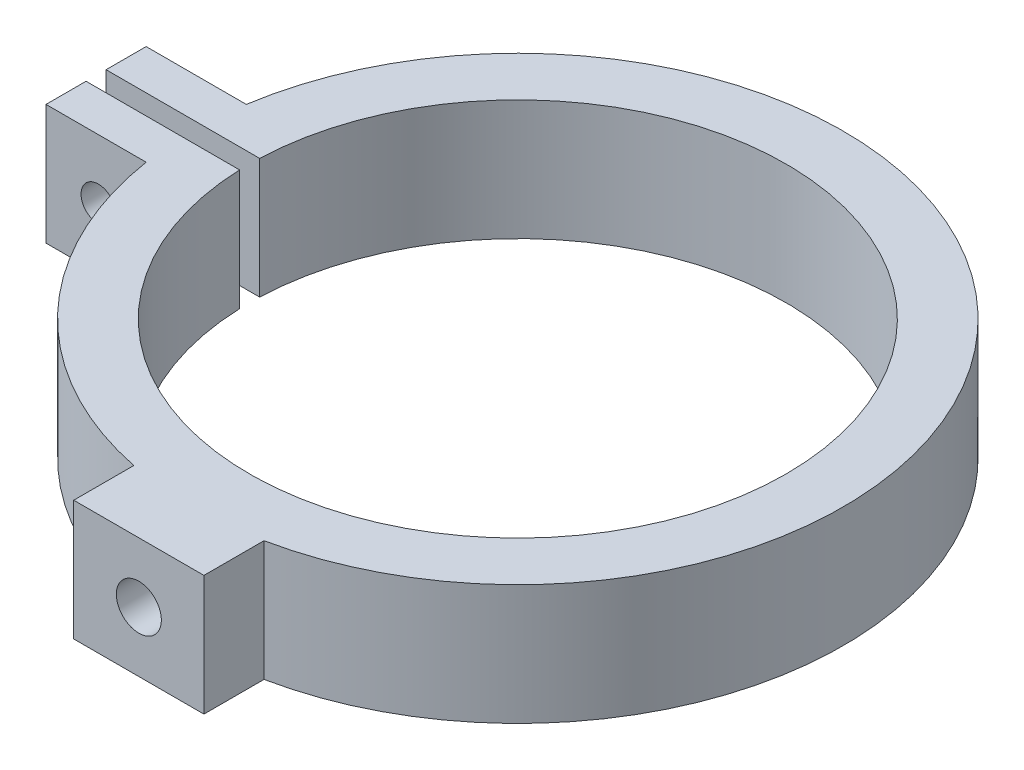
ISO-10303-21;
HEADER;
FILE_DESCRIPTION(('STEP AP214'),'2;1');
FILE_NAME('part.step','',(''),(''),'','','');
FILE_SCHEMA(('AUTOMOTIVE_DESIGN { 1 0 10303 214 1 1 1 1 }'));
ENDSEC;
DATA;
#1=APPLICATION_CONTEXT('core data for automotive mechanical design processes');
#2=APPLICATION_PROTOCOL_DEFINITION('international standard','automotive_design',2000,#1);
#3=PRODUCT_CONTEXT('',#1,'mechanical');
#4=PRODUCT('Part','Part','',(#3));
#5=PRODUCT_RELATED_PRODUCT_CATEGORY('part','',(#4));
#6=PRODUCT_DEFINITION_FORMATION('','',#4);
#7=PRODUCT_DEFINITION_CONTEXT('part definition',#1,'design');
#8=PRODUCT_DEFINITION('design','',#6,#7);
#9=PRODUCT_DEFINITION_SHAPE('','',#8);
#10=(LENGTH_UNIT() NAMED_UNIT(*) SI_UNIT(.MILLI.,.METRE.));
#11=(NAMED_UNIT(*) PLANE_ANGLE_UNIT() SI_UNIT($,.RADIAN.));
#12=(NAMED_UNIT(*) SI_UNIT($,.STERADIAN.) SOLID_ANGLE_UNIT());
#13=UNCERTAINTY_MEASURE_WITH_UNIT(LENGTH_MEASURE(1.E-05),#10,'distance_accuracy_value','');
#14=(GEOMETRIC_REPRESENTATION_CONTEXT(3) GLOBAL_UNCERTAINTY_ASSIGNED_CONTEXT((#13)) GLOBAL_UNIT_ASSIGNED_CONTEXT((#10,
#11,#12)) REPRESENTATION_CONTEXT('',''));
#15=CARTESIAN_POINT('',(0.,0.,0.));
#16=DIRECTION('',(0.,0.,1.));
#17=DIRECTION('',(1.,0.,0.));
#18=AXIS2_PLACEMENT_3D('',#15,#16,#17);
#19=CARTESIAN_POINT('',(0.,-6.,-0.999999999999996));
#20=DIRECTION('',(0.,0.,-1.));
#21=DIRECTION('',(-1.,0.,0.));
#22=AXIS2_PLACEMENT_3D('',#19,#20,#21);
#23=PLANE('',#22);
#24=DIRECTION('',(-1.,0.,0.));
#25=VECTOR('',#24,1.);
#26=CARTESIAN_POINT('',(0.,-6.,-0.999999999999996));
#27=LINE('',#26,#25);
#28=CARTESIAN_POINT('',(-26.7813367851569,-6.,-0.999999999999999));
#29=VERTEX_POINT('',#28);
#30=CARTESIAN_POINT('',(-42.1130814466628,-6.,-0.999999999999998));
#31=VERTEX_POINT('',#30);
#32=EDGE_CURVE('E153',#29,#31,#27,.T.);
#33=ORIENTED_EDGE('',*,*,#32,.F.);
#34=DIRECTION('',(0.,-1.,0.));
#35=VECTOR('',#34,1.);
#36=CARTESIAN_POINT('',(-26.7813367851569,6.,-0.999999999999999));
#37=LINE('',#36,#35);
#38=CARTESIAN_POINT('',(-26.7813367851569,6.,-0.999999999999999));
#39=VERTEX_POINT('',#38);
#40=EDGE_CURVE('E53',#29,#39,#37,.F.);
#41=ORIENTED_EDGE('',*,*,#40,.T.);
#42=DIRECTION('',(-1.,0.,0.));
#43=VECTOR('',#42,1.);
#44=CARTESIAN_POINT('',(0.,6.,-0.999999999999996));
#45=LINE('',#44,#43);
#46=CARTESIAN_POINT('',(-42.1130814466628,6.,-0.999999999999998));
#47=VERTEX_POINT('',#46);
#48=EDGE_CURVE('E194',#39,#47,#45,.T.);
#49=ORIENTED_EDGE('',*,*,#48,.T.);
#50=DIRECTION('',(0.,1.,0.));
#51=VECTOR('',#50,1.);
#52=CARTESIAN_POINT('',(-42.1130814466628,-6.,-0.999999999999998));
#53=LINE('',#52,#51);
#54=EDGE_CURVE('E145',#31,#47,#53,.T.);
#55=ORIENTED_EDGE('',*,*,#54,.F.);
#56=EDGE_LOOP('',(#33,#41,#49,#55));
#57=FACE_BOUND('',#56,.T.);
#58=CARTESIAN_POINT('',(-36.8856405730695,0.,-1.));
#59=DIRECTION('',(0.,0.,-1.));
#60=DIRECTION('',(-1.,0.,0.));
#61=AXIS2_PLACEMENT_3D('',#58,#59,#60);
#62=CIRCLE('',#61,2.45744999999999);
#63=CARTESIAN_POINT('',(-39.3430905730695,0.,-1.));
#64=VERTEX_POINT('',#63);
#65=EDGE_CURVE('E285',#64,#64,#62,.F.);
#66=ORIENTED_EDGE('',*,*,#65,.F.);
#67=EDGE_LOOP('',(#66));
#68=FACE_BOUND('',#67,.T.);
#69=ADVANCED_FACE('F43',(#57,#68),#23,.F.);
#70=CARTESIAN_POINT('',(0.,6.,0.));
#71=DIRECTION('',(0.,-1.,0.));
#72=DIRECTION('',(0.,0.,-1.));
#73=AXIS2_PLACEMENT_3D('',#70,#71,#72);
#74=CYLINDRICAL_SURFACE('',#73,32.5);
#75=CARTESIAN_POINT('',(0.,6.,0.));
#76=DIRECTION('',(0.,1.,0.));
#77=DIRECTION('',(0.,0.,1.));
#78=AXIS2_PLACEMENT_3D('',#75,#76,#77);
#79=CIRCLE('',#78,32.5);
#80=CARTESIAN_POINT('',(-32.1130814466628,6.,5.));
#81=VERTEX_POINT('',#80);
#82=CARTESIAN_POINT('',(-6.5,6.,31.8433666561813));
#83=VERTEX_POINT('',#82);
#84=EDGE_CURVE('E303',#81,#83,#79,.T.);
#85=ORIENTED_EDGE('',*,*,#84,.F.);
#86=DIRECTION('',(0.,1.,0.));
#87=VECTOR('',#86,1.);
#88=CARTESIAN_POINT('',(-32.1130814466628,-6.,5.));
#89=LINE('',#88,#87);
#90=CARTESIAN_POINT('',(-32.1130814466628,-6.,5.));
#91=VERTEX_POINT('',#90);
#92=EDGE_CURVE('E190',#91,#81,#89,.T.);
#93=ORIENTED_EDGE('',*,*,#92,.F.);
#94=CARTESIAN_POINT('',(0.,-6.,0.));
#95=DIRECTION('',(0.,1.,0.));
#96=DIRECTION('',(0.,0.,1.));
#97=AXIS2_PLACEMENT_3D('',#94,#95,#96);
#98=CIRCLE('',#97,32.5);
#99=CARTESIAN_POINT('',(-6.5,-6.,31.8433666561813));
#100=VERTEX_POINT('',#99);
#101=EDGE_CURVE('E311',#91,#100,#98,.T.);
#102=ORIENTED_EDGE('',*,*,#101,.T.);
#103=DIRECTION('',(0.,-1.,0.));
#104=VECTOR('',#103,1.);
#105=CARTESIAN_POINT('',(-6.5,6.,31.8433666561813));
#106=LINE('',#105,#104);
#107=EDGE_CURVE('E345',#83,#100,#106,.T.);
#108=ORIENTED_EDGE('',*,*,#107,.F.);
#109=EDGE_LOOP('',(#85,#93,#102,#108));
#110=FACE_BOUND('',#109,.T.);
#111=ADVANCED_FACE('F255',(#110),#74,.T.);
#112=CARTESIAN_POINT('',(0.,6.,0.));
#113=DIRECTION('',(0.,1.,0.));
#114=DIRECTION('',(0.,0.,1.));
#115=AXIS2_PLACEMENT_3D('',#112,#113,#114);
#116=PLANE('',#115);
#117=DIRECTION('',(1.,0.,0.));
#118=VECTOR('',#117,1.);
#119=CARTESIAN_POINT('',(0.,6.,0.999999999999996));
#120=LINE('',#119,#118);
#121=CARTESIAN_POINT('',(-42.1130814466628,6.,1.));
#122=VERTEX_POINT('',#121);
#123=CARTESIAN_POINT('',(-26.7813367851569,6.,0.999999999999999));
#124=VERTEX_POINT('',#123);
#125=EDGE_CURVE('E204',#122,#124,#120,.T.);
#126=ORIENTED_EDGE('',*,*,#125,.F.);
#127=DIRECTION('',(0.,0.,1.));
#128=VECTOR('',#127,1.);
#129=CARTESIAN_POINT('',(-42.1130814466628,6.,1.));
#130=LINE('',#129,#128);
#131=CARTESIAN_POINT('',(-42.1130814466628,6.,5.));
#132=VERTEX_POINT('',#131);
#133=EDGE_CURVE('E170',#122,#132,#130,.T.);
#134=ORIENTED_EDGE('',*,*,#133,.T.);
#135=DIRECTION('',(1.,0.,0.));
#136=VECTOR('',#135,1.);
#137=CARTESIAN_POINT('',(-42.1130814466628,6.,5.));
#138=LINE('',#137,#136);
#139=EDGE_CURVE('E179',#132,#81,#138,.T.);
#140=ORIENTED_EDGE('',*,*,#139,.T.);
#141=ORIENTED_EDGE('',*,*,#84,.T.);
#142=DIRECTION('',(0.,0.,1.));
#143=VECTOR('',#142,1.);
#144=CARTESIAN_POINT('',(-6.5,6.,37.8433666561813));
#145=LINE('',#144,#143);
#146=CARTESIAN_POINT('',(-6.5,6.,37.8433666561813));
#147=VERTEX_POINT('',#146);
#148=EDGE_CURVE('E362',#83,#147,#145,.T.);
#149=ORIENTED_EDGE('',*,*,#148,.T.);
#150=DIRECTION('',(1.,0.,0.));
#151=VECTOR('',#150,1.);
#152=CARTESIAN_POINT('',(6.5,6.,37.8433666561813));
#153=LINE('',#152,#151);
#154=CARTESIAN_POINT('',(6.5,6.,37.8433666561813));
#155=VERTEX_POINT('',#154);
#156=EDGE_CURVE('E364',#147,#155,#153,.T.);
#157=ORIENTED_EDGE('',*,*,#156,.T.);
#158=DIRECTION('',(0.,0.,-1.));
#159=VECTOR('',#158,1.);
#160=CARTESIAN_POINT('',(6.5,6.,31.8433666561813));
#161=LINE('',#160,#159);
#162=CARTESIAN_POINT('',(6.5,6.,31.8433666561813));
#163=VERTEX_POINT('',#162);
#164=EDGE_CURVE('E324',#155,#163,#161,.T.);
#165=ORIENTED_EDGE('',*,*,#164,.T.);
#166=CARTESIAN_POINT('',(-32.1130814466628,6.,-5.));
#167=VERTEX_POINT('',#166);
#168=EDGE_CURVE('E359',#163,#167,#79,.T.);
#169=ORIENTED_EDGE('',*,*,#168,.T.);
#170=DIRECTION('',(-1.,0.,0.));
#171=VECTOR('',#170,1.);
#172=CARTESIAN_POINT('',(-42.1130814466628,6.,-5.));
#173=LINE('',#172,#171);
#174=CARTESIAN_POINT('',(-42.1130814466628,6.,-5.));
#175=VERTEX_POINT('',#174);
#176=EDGE_CURVE('E161',#167,#175,#173,.T.);
#177=ORIENTED_EDGE('',*,*,#176,.T.);
#178=DIRECTION('',(0.,0.,1.));
#179=VECTOR('',#178,1.);
#180=CARTESIAN_POINT('',(-42.1130814466628,6.,-0.999999999999998));
#181=LINE('',#180,#179);
#182=EDGE_CURVE('E139',#175,#47,#181,.T.);
#183=ORIENTED_EDGE('',*,*,#182,.T.);
#184=ORIENTED_EDGE('',*,*,#48,.F.);
#185=CARTESIAN_POINT('',(0.,6.,0.));
#186=DIRECTION('',(0.,1.,0.));
#187=DIRECTION('',(0.,0.,1.));
#188=AXIS2_PLACEMENT_3D('',#185,#186,#187);
#189=CIRCLE('',#188,26.8);
#190=EDGE_CURVE('E234',#124,#39,#189,.T.);
#191=ORIENTED_EDGE('',*,*,#190,.F.);
#192=EDGE_LOOP('',(#126,#134,#140,#141,#149,#157,#165,#169,#177,#183,#184,#191));
#193=FACE_BOUND('',#192,.T.);
#194=ADVANCED_FACE('F302',(#193),#116,.T.);
#195=CARTESIAN_POINT('',(0.,-6.,0.));
#196=DIRECTION('',(0.,1.,0.));
#197=DIRECTION('',(0.,0.,1.));
#198=AXIS2_PLACEMENT_3D('',#195,#196,#197);
#199=PLANE('',#198);
#200=ORIENTED_EDGE('',*,*,#101,.F.);
#201=DIRECTION('',(1.,0.,0.));
#202=VECTOR('',#201,1.);
#203=CARTESIAN_POINT('',(-42.1130814466628,-6.,5.));
#204=LINE('',#203,#202);
#205=CARTESIAN_POINT('',(-42.1130814466628,-6.,5.));
#206=VERTEX_POINT('',#205);
#207=EDGE_CURVE('E178',#206,#91,#204,.T.);
#208=ORIENTED_EDGE('',*,*,#207,.F.);
#209=DIRECTION('',(0.,0.,1.));
#210=VECTOR('',#209,1.);
#211=CARTESIAN_POINT('',(-42.1130814466628,-6.,1.));
#212=LINE('',#211,#210);
#213=CARTESIAN_POINT('',(-42.1130814466628,-6.,1.));
#214=VERTEX_POINT('',#213);
#215=EDGE_CURVE('E174',#214,#206,#212,.T.);
#216=ORIENTED_EDGE('',*,*,#215,.F.);
#217=DIRECTION('',(1.,0.,0.));
#218=VECTOR('',#217,1.);
#219=CARTESIAN_POINT('',(0.,-6.,0.999999999999996));
#220=LINE('',#219,#218);
#221=CARTESIAN_POINT('',(-26.7813367851569,-6.,0.999999999999999));
#222=VERTEX_POINT('',#221);
#223=EDGE_CURVE('E203',#214,#222,#220,.T.);
#224=ORIENTED_EDGE('',*,*,#223,.T.);
#225=CARTESIAN_POINT('',(0.,-6.,0.));
#226=DIRECTION('',(0.,1.,0.));
#227=DIRECTION('',(0.,0.,1.));
#228=AXIS2_PLACEMENT_3D('',#225,#226,#227);
#229=CIRCLE('',#228,26.8);
#230=EDGE_CURVE('E233',#222,#29,#229,.T.);
#231=ORIENTED_EDGE('',*,*,#230,.T.);
#232=ORIENTED_EDGE('',*,*,#32,.T.);
#233=DIRECTION('',(0.,0.,1.));
#234=VECTOR('',#233,1.);
#235=CARTESIAN_POINT('',(-42.1130814466628,-6.,-0.999999999999998));
#236=LINE('',#235,#234);
#237=CARTESIAN_POINT('',(-42.1130814466628,-6.,-5.));
#238=VERTEX_POINT('',#237);
#239=EDGE_CURVE('E137',#238,#31,#236,.T.);
#240=ORIENTED_EDGE('',*,*,#239,.F.);
#241=DIRECTION('',(-1.,0.,0.));
#242=VECTOR('',#241,1.);
#243=CARTESIAN_POINT('',(-42.1130814466628,-6.,-5.));
#244=LINE('',#243,#242);
#245=CARTESIAN_POINT('',(-32.1130814466628,-6.,-5.));
#246=VERTEX_POINT('',#245);
#247=EDGE_CURVE('E151',#246,#238,#244,.T.);
#248=ORIENTED_EDGE('',*,*,#247,.F.);
#249=CARTESIAN_POINT('',(6.5,-6.,31.8433666561813));
#250=VERTEX_POINT('',#249);
#251=EDGE_CURVE('E65',#250,#246,#98,.T.);
#252=ORIENTED_EDGE('',*,*,#251,.F.);
#253=DIRECTION('',(0.,0.,-1.));
#254=VECTOR('',#253,1.);
#255=CARTESIAN_POINT('',(6.5,-6.,31.8433666561813));
#256=LINE('',#255,#254);
#257=CARTESIAN_POINT('',(6.5,-6.,37.8433666561813));
#258=VERTEX_POINT('',#257);
#259=EDGE_CURVE('E331',#258,#250,#256,.T.);
#260=ORIENTED_EDGE('',*,*,#259,.F.);
#261=DIRECTION('',(1.,0.,0.));
#262=VECTOR('',#261,1.);
#263=CARTESIAN_POINT('',(6.5,-6.,37.8433666561813));
#264=LINE('',#263,#262);
#265=CARTESIAN_POINT('',(-6.5,-6.,37.8433666561813));
#266=VERTEX_POINT('',#265);
#267=EDGE_CURVE('E328',#266,#258,#264,.T.);
#268=ORIENTED_EDGE('',*,*,#267,.F.);
#269=DIRECTION('',(0.,0.,1.));
#270=VECTOR('',#269,1.);
#271=CARTESIAN_POINT('',(-6.5,-6.,37.8433666561813));
#272=LINE('',#271,#270);
#273=EDGE_CURVE('E313',#100,#266,#272,.T.);
#274=ORIENTED_EDGE('',*,*,#273,.F.);
#275=EDGE_LOOP('',(#200,#208,#216,#224,#231,#232,#240,#248,#252,#260,#268,#274));
#276=FACE_BOUND('',#275,.T.);
#277=ADVANCED_FACE('F150',(#276),#199,.F.);
#278=ORIENTED_EDGE('',*,*,#251,.T.);
#279=DIRECTION('',(0.,1.,0.));
#280=VECTOR('',#279,1.);
#281=CARTESIAN_POINT('',(-32.1130814466628,-6.,-5.));
#282=LINE('',#281,#280);
#283=EDGE_CURVE('E60',#246,#167,#282,.T.);
#284=ORIENTED_EDGE('',*,*,#283,.T.);
#285=ORIENTED_EDGE('',*,*,#168,.F.);
#286=DIRECTION('',(0.,-1.,0.));
#287=VECTOR('',#286,1.);
#288=CARTESIAN_POINT('',(6.5,6.,31.8433666561813));
#289=LINE('',#288,#287);
#290=EDGE_CURVE('E334',#163,#250,#289,.T.);
#291=ORIENTED_EDGE('',*,*,#290,.T.);
#292=EDGE_LOOP('',(#278,#284,#285,#291));
#293=FACE_BOUND('',#292,.T.);
#294=ADVANCED_FACE('F45',(#293),#74,.T.);
#295=CARTESIAN_POINT('',(-6.5,6.,37.8433666561813));
#296=DIRECTION('',(1.,0.,0.));
#297=DIRECTION('',(0.,0.,-1.));
#298=AXIS2_PLACEMENT_3D('',#295,#296,#297);
#299=PLANE('',#298);
#300=ORIENTED_EDGE('',*,*,#273,.T.);
#301=DIRECTION('',(0.,-1.,0.));
#302=VECTOR('',#301,1.);
#303=CARTESIAN_POINT('',(-6.5,6.,37.8433666561813));
#304=LINE('',#303,#302);
#305=EDGE_CURVE('E341',#147,#266,#304,.T.);
#306=ORIENTED_EDGE('',*,*,#305,.F.);
#307=ORIENTED_EDGE('',*,*,#148,.F.);
#308=ORIENTED_EDGE('',*,*,#107,.T.);
#309=EDGE_LOOP('',(#300,#306,#307,#308));
#310=FACE_BOUND('',#309,.T.);
#311=ADVANCED_FACE('F375',(#310),#299,.F.);
#312=CARTESIAN_POINT('',(6.5,6.,37.8433666561813));
#313=DIRECTION('',(0.,0.,-1.));
#314=DIRECTION('',(-1.,0.,0.));
#315=AXIS2_PLACEMENT_3D('',#312,#313,#314);
#316=PLANE('',#315);
#317=CARTESIAN_POINT('',(0.,0.,37.8433666561813));
#318=DIRECTION('',(0.,0.,-1.));
#319=DIRECTION('',(-1.,0.,0.));
#320=AXIS2_PLACEMENT_3D('',#317,#318,#319);
#321=CIRCLE('',#320,2.2479);
#322=CARTESIAN_POINT('',(-2.2479,0.,37.8433666561813));
#323=VERTEX_POINT('',#322);
#324=EDGE_CURVE('E220',#323,#323,#321,.T.);
#325=ORIENTED_EDGE('',*,*,#324,.T.);
#326=EDGE_LOOP('',(#325));
#327=FACE_BOUND('',#326,.T.);
#328=ORIENTED_EDGE('',*,*,#267,.T.);
#329=DIRECTION('',(0.,-1.,0.));
#330=VECTOR('',#329,1.);
#331=CARTESIAN_POINT('',(6.5,6.,37.8433666561813));
#332=LINE('',#331,#330);
#333=EDGE_CURVE('E337',#155,#258,#332,.T.);
#334=ORIENTED_EDGE('',*,*,#333,.F.);
#335=ORIENTED_EDGE('',*,*,#156,.F.);
#336=ORIENTED_EDGE('',*,*,#305,.T.);
#337=EDGE_LOOP('',(#328,#334,#335,#336));
#338=FACE_BOUND('',#337,.T.);
#339=ADVANCED_FACE('F380',(#327,#338),#316,.F.);
#340=CARTESIAN_POINT('',(6.5,6.,31.8433666561813));
#341=DIRECTION('',(-1.,0.,0.));
#342=DIRECTION('',(0.,0.,1.));
#343=AXIS2_PLACEMENT_3D('',#340,#341,#342);
#344=PLANE('',#343);
#345=ORIENTED_EDGE('',*,*,#259,.T.);
#346=ORIENTED_EDGE('',*,*,#290,.F.);
#347=ORIENTED_EDGE('',*,*,#164,.F.);
#348=ORIENTED_EDGE('',*,*,#333,.T.);
#349=EDGE_LOOP('',(#345,#346,#347,#348));
#350=FACE_BOUND('',#349,.T.);
#351=ADVANCED_FACE('F372',(#350),#344,.F.);
#352=CARTESIAN_POINT('',(0.,6.,0.));
#353=DIRECTION('',(0.,-1.,0.));
#354=DIRECTION('',(0.,0.,-1.));
#355=AXIS2_PLACEMENT_3D('',#352,#353,#354);
#356=CYLINDRICAL_SURFACE('',#355,26.8);
#357=DIRECTION('',(0.,-1.,0.));
#358=VECTOR('',#357,1.);
#359=CARTESIAN_POINT('',(-26.7813367851569,6.,0.999999999999999));
#360=LINE('',#359,#358);
#361=EDGE_CURVE('E11',#124,#222,#360,.T.);
#362=ORIENTED_EDGE('',*,*,#361,.F.);
#363=ORIENTED_EDGE('',*,*,#190,.T.);
#364=ORIENTED_EDGE('',*,*,#40,.F.);
#365=ORIENTED_EDGE('',*,*,#230,.F.);
#366=EDGE_LOOP('',(#362,#363,#364,#365));
#367=FACE_BOUND('',#366,.T.);
#368=CARTESIAN_POINT('',(0.,-3.96875,26.8));
#369=CARTESIAN_POINT('',(-0.221626137336164,-3.96874083522443,26.7999964796025));
#370=CARTESIAN_POINT('',(-0.443381694391725,-3.95012299588557,26.7972220204617));
#371=CARTESIAN_POINT('',(-0.880696702474216,-3.87616110261432,26.786421161482));
#372=CARTESIAN_POINT('',(-1.09624986828032,-3.82078107452425,26.7783896173559));
#373=CARTESIAN_POINT('',(-1.51476780045809,-3.67498393202581,26.7579773376409));
#374=CARTESIAN_POINT('',(-1.71774186408129,-3.58459306130133,26.7455998603565));
#375=CARTESIAN_POINT('',(-2.10560945692425,-3.37140369860623,26.7178641563164));
#376=CARTESIAN_POINT('',(-2.29050554059851,-3.24860979434498,26.702506351605));
#377=CARTESIAN_POINT('',(-2.63840954810068,-2.97310255249593,26.6703875002997));
#378=CARTESIAN_POINT('',(-2.80125972545817,-2.82019102709893,26.6536176043191));
#379=CARTESIAN_POINT('',(-3.09908838697648,-2.48921556897836,26.6206340769547));
#380=CARTESIAN_POINT('',(-3.23406528397841,-2.31115020491794,26.6044204772913));
#381=CARTESIAN_POINT('',(-3.47292788225807,-1.93386451931966,26.5742993598755));
#382=CARTESIAN_POINT('',(-3.57666133981339,-1.73454681898824,26.5604032769813));
#383=CARTESIAN_POINT('',(-3.74911957863299,-1.32107753384957,26.5366110835097));
#384=CARTESIAN_POINT('',(-3.81784621920209,-1.10692673755378,26.5267147605001));
#385=CARTESIAN_POINT('',(-3.91785084541806,-0.671527607975011,26.5121294074838));
#386=CARTESIAN_POINT('',(-3.94939861793905,-0.450342519606584,26.5074028813145));
#387=CARTESIAN_POINT('',(-3.97498567851287,-0.00577125210217825,26.5035783739364));
#388=CARTESIAN_POINT('',(-3.96902706639187,0.217614803111724,26.5044800776264));
#389=CARTESIAN_POINT('',(-3.91999105630468,0.658343217500313,26.5117758580114));
#390=CARTESIAN_POINT('',(-3.87721386014361,0.875719818668191,26.5181255132971));
#391=CARTESIAN_POINT('',(-3.75622477732844,1.30017558740772,26.5355323685693));
#392=CARTESIAN_POINT('',(-3.67801191153343,1.50725447026243,26.5465896986355));
#393=CARTESIAN_POINT('',(-3.48805857682089,1.90615156194393,26.5722151969266));
#394=CARTESIAN_POINT('',(-3.37619067886529,2.09790820003154,26.5867966666945));
#395=CARTESIAN_POINT('',(-3.12219358338452,2.46004180309356,26.6178178137114));
#396=CARTESIAN_POINT('',(-2.98006244933735,2.63041739880155,26.6342576098417));
#397=CARTESIAN_POINT('',(-2.66792429605483,2.94669265406062,26.6673394292209));
#398=CARTESIAN_POINT('',(-2.49765911823017,3.09233760971875,26.6839818619412));
#399=CARTESIAN_POINT('',(-2.13496669396101,3.35302384905361,26.7154448962442));
#400=CARTESIAN_POINT('',(-1.94253935486743,3.46806500478425,26.7302654902102));
#401=CARTESIAN_POINT('',(-1.54076615287599,3.66429007617524,26.7564298900166));
#402=CARTESIAN_POINT('',(-1.33141070433859,3.74545464646807,26.7677717083102));
#403=CARTESIAN_POINT('',(-0.901835749206267,3.87140274544479,26.7856839252012));
#404=CARTESIAN_POINT('',(-0.681616959305032,3.91618867076285,26.7922546381174));
#405=CARTESIAN_POINT('',(-0.238765131283214,3.96777019351551,26.7998427384719));
#406=CARTESIAN_POINT('',(-0.0161737304146491,3.97491601462524,26.8009113185918));
#407=CARTESIAN_POINT('',(0.427029153826445,3.95194364549265,26.7975140110876));
#408=CARTESIAN_POINT('',(0.647640696692661,3.92182657878249,26.7930482903311));
#409=CARTESIAN_POINT('',(1.07956294663639,3.82547455516138,26.7791158278251));
#410=CARTESIAN_POINT('',(1.29091247591184,3.75940992484446,26.769672676669));
#411=CARTESIAN_POINT('',(1.69953498190126,3.59321751387437,26.7468408870455));
#412=CARTESIAN_POINT('',(1.8968073115987,3.49308816875643,26.7334520673721));
#413=CARTESIAN_POINT('',(2.27321759601365,3.26078486649638,26.7040899300845));
#414=CARTESIAN_POINT('',(2.45221681483138,3.12838838551389,26.6880989331949));
#415=CARTESIAN_POINT('',(2.78558031630514,2.83561928246008,26.6553681573543));
#416=CARTESIAN_POINT('',(2.93994320446356,2.67524507783194,26.638628336086));
#417=CARTESIAN_POINT('',(3.22092397911067,2.32951515009358,26.6061246235945));
#418=CARTESIAN_POINT('',(3.34730730633922,2.14396782310116,26.5903697232118));
#419=CARTESIAN_POINT('',(3.5671118314058,1.75407197118202,26.5617780042105));
#420=CARTESIAN_POINT('',(3.66053390197611,1.54972394423181,26.5489411083337));
#421=CARTESIAN_POINT('',(3.81139911882431,1.12873154564442,26.5277036303835));
#422=CARTESIAN_POINT('',(3.86896642541743,0.912132473045617,26.5192877549348));
#423=CARTESIAN_POINT('',(3.94688357136171,0.472206747966822,26.5078042730157));
#424=CARTESIAN_POINT('',(3.96723591015351,0.248880548319873,26.5047363073683));
#425=CARTESIAN_POINT('',(3.97008705150493,-0.195822493490729,26.5043091877935));
#426=CARTESIAN_POINT('',(3.95295462974441,-0.417197006290576,26.5068944174998));
#427=CARTESIAN_POINT('',(3.88211207135552,-0.853879718116667,26.5173616346256));
#428=CARTESIAN_POINT('',(3.82840198748766,-1.06918792589263,26.5252436144049));
#429=CARTESIAN_POINT('',(3.68605792776128,-1.48752841554452,26.5453969719125));
#430=CARTESIAN_POINT('',(3.5974490741098,-1.69056940709065,26.5576651915803));
#431=CARTESIAN_POINT('',(3.38785937705554,-2.07896267162193,26.5852126558494));
#432=CARTESIAN_POINT('',(3.26687749362973,-2.26431437605761,26.6004919971827));
#433=CARTESIAN_POINT('',(2.99463371821091,-2.61394226721925,26.6325191706846));
#434=CARTESIAN_POINT('',(2.84309852960002,-2.77800453233686,26.6492794293526));
#435=CARTESIAN_POINT('',(2.51462706143237,-3.07850319338837,26.6822757370307));
#436=CARTESIAN_POINT('',(2.33768488010029,-3.21493315283154,26.6985116631676));
#437=CARTESIAN_POINT('',(1.96230864205491,-3.456945408198,26.7287291078406));
#438=CARTESIAN_POINT('',(1.7637645215455,-3.56235852215309,26.7426980823948));
#439=CARTESIAN_POINT('',(1.35167754802771,-3.73818441138115,26.7666844694946));
#440=CARTESIAN_POINT('',(1.1381505579786,-3.80863358476982,26.7767059891618));
#441=CARTESIAN_POINT('',(0.769710972692377,-3.89647620557749,26.7893700707113));
#442=CARTESIAN_POINT('',(0.617077001393115,-3.92353766522845,26.7933359094808));
#443=CARTESIAN_POINT('',(0.309649731319854,-3.95967765676379,26.7986520883878));
#444=CARTESIAN_POINT('',(0.154856458389409,-3.96875640368823,26.8000024598014));
#445=CARTESIAN_POINT('',(0.,-3.96875,26.8));
#446=B_SPLINE_CURVE_WITH_KNOTS('',3,(#368,#369,#370,#371,#372,#373,#374,#375,#376,#377,#378,
#379,#380,#381,#382,#383,#384,#385,#386,#387,#388,#389,#390,#391,#392,#393,#394,#395,#396,#397,
#398,#399,#400,#401,#402,#403,#404,#405,#406,#407,#408,#409,#410,#411,#412,#413,#414,#415,#416,
#417,#418,#419,#420,#421,#422,#423,#424,#425,#426,#427,#428,#429,#430,#431,#432,#433,#434,#435,
#436,#437,#438,#439,#440,#441,#442,#443,#444,#445),.UNSPECIFIED.,.T.,.F.,(4,2,2,2,2,2,2,2,2,2,2,
2,2,2,2,2,2,2,2,2,2,2,2,2,2,2,2,2,2,2,2,2,2,2,2,2,2,2,4),(0.,0.664312568367534,1.32927616935205,
1.9937422836882,2.65811437153895,3.32701391851815,3.99595154344421,4.66809792325,
5.34020859985684,6.00741150133097,6.67457704922729,7.33635381773275,7.9981488732423,
8.66248193237197,9.32685751446295,9.99770758412948,10.6685604583917,11.3397959036122,
12.0109871240874,12.6759220469722,13.3408369215571,14.0026283909165,14.6644502579834,
15.3309722406634,15.9975319373167,16.6694840895488,17.3414184488201,18.0110128591429,
18.6805622963525,19.3435543381296,20.0065454235929,20.6690601184565,21.3315960999678,
22.0003446503503,22.6692487960001,23.3417365891551,24.0135228337648,24.4777023887214,
24.9418763929136),.UNSPECIFIED.);
#447=CARTESIAN_POINT('',(0.,-3.96875,26.8));
#448=VERTEX_POINT('',#447);
#449=EDGE_CURVE('E224',#448,#448,#446,.T.);
#450=ORIENTED_EDGE('',*,*,#449,.F.);
#451=EDGE_LOOP('',(#450));
#452=FACE_BOUND('',#451,.T.);
#453=ADVANCED_FACE('F243',(#367,#452),#356,.F.);
#454=CARTESIAN_POINT('',(0.,0.,26.8));
#455=DIRECTION('',(0.,0.,-1.));
#456=DIRECTION('',(-1.,0.,0.));
#457=AXIS2_PLACEMENT_3D('',#454,#455,#456);
#458=CYLINDRICAL_SURFACE('',#457,3.96875);
#459=ORIENTED_EDGE('',*,*,#449,.T.);
#460=EDGE_LOOP('',(#459));
#461=FACE_BOUND('',#460,.T.);
#462=CARTESIAN_POINT('',(0.,0.,30.9656));
#463=DIRECTION('',(0.,0.,-1.));
#464=DIRECTION('',(-1.,0.,0.));
#465=AXIS2_PLACEMENT_3D('',#462,#463,#464);
#466=CIRCLE('',#465,3.96875);
#467=CARTESIAN_POINT('',(-3.96875,0.,30.9656));
#468=VERTEX_POINT('',#467);
#469=EDGE_CURVE('E208',#468,#468,#466,.T.);
#470=ORIENTED_EDGE('',*,*,#469,.F.);
#471=EDGE_LOOP('',(#470));
#472=FACE_BOUND('',#471,.T.);
#473=ADVANCED_FACE('F238',(#461,#472),#458,.F.);
#474=CARTESIAN_POINT('',(0.,0.,26.8));
#475=DIRECTION('',(0.,0.,-1.));
#476=DIRECTION('',(-1.,0.,0.));
#477=AXIS2_PLACEMENT_3D('',#474,#475,#476);
#478=CYLINDRICAL_SURFACE('',#477,2.2479);
#479=ORIENTED_EDGE('',*,*,#324,.F.);
#480=EDGE_LOOP('',(#479));
#481=FACE_BOUND('',#480,.T.);
#482=CARTESIAN_POINT('',(0.,0.,30.9656));
#483=DIRECTION('',(0.,0.,-1.));
#484=DIRECTION('',(-1.,0.,0.));
#485=AXIS2_PLACEMENT_3D('',#482,#483,#484);
#486=CIRCLE('',#485,2.2479);
#487=CARTESIAN_POINT('',(-2.2479,0.,30.9656));
#488=VERTEX_POINT('',#487);
#489=EDGE_CURVE('E216',#488,#488,#486,.T.);
#490=ORIENTED_EDGE('',*,*,#489,.T.);
#491=EDGE_LOOP('',(#490));
#492=FACE_BOUND('',#491,.T.);
#493=ADVANCED_FACE('F242',(#481,#492),#478,.F.);
#494=CARTESIAN_POINT('',(2.2479,0.,30.9656));
#495=DIRECTION('',(0.,0.,1.));
#496=DIRECTION('',(1.,0.,0.));
#497=AXIS2_PLACEMENT_3D('',#494,#495,#496);
#498=PLANE('',#497);
#499=ORIENTED_EDGE('',*,*,#489,.F.);
#500=EDGE_LOOP('',(#499));
#501=FACE_BOUND('',#500,.T.);
#502=ORIENTED_EDGE('',*,*,#469,.T.);
#503=EDGE_LOOP('',(#502));
#504=FACE_BOUND('',#503,.T.);
#505=ADVANCED_FACE('F247',(#501,#504),#498,.F.);
#506=CARTESIAN_POINT('',(0.,-6.,0.999999999999996));
#507=DIRECTION('',(0.,0.,1.));
#508=DIRECTION('',(1.,0.,0.));
#509=AXIS2_PLACEMENT_3D('',#506,#507,#508);
#510=PLANE('',#509);
#511=CARTESIAN_POINT('',(-36.8856405730695,0.,1.));
#512=DIRECTION('',(0.,0.,1.));
#513=DIRECTION('',(1.,0.,0.));
#514=AXIS2_PLACEMENT_3D('',#511,#512,#513);
#515=CIRCLE('',#514,1.72719999999999);
#516=CARTESIAN_POINT('',(-35.1584405730695,0.,1.));
#517=VERTEX_POINT('',#516);
#518=EDGE_CURVE('E47',#517,#517,#515,.T.);
#519=ORIENTED_EDGE('',*,*,#518,.T.);
#520=EDGE_LOOP('',(#519));
#521=FACE_BOUND('',#520,.T.);
#522=ORIENTED_EDGE('',*,*,#125,.T.);
#523=ORIENTED_EDGE('',*,*,#361,.T.);
#524=ORIENTED_EDGE('',*,*,#223,.F.);
#525=DIRECTION('',(0.,1.,0.));
#526=VECTOR('',#525,1.);
#527=CARTESIAN_POINT('',(-42.1130814466628,-6.,1.));
#528=LINE('',#527,#526);
#529=EDGE_CURVE('E183',#214,#122,#528,.T.);
#530=ORIENTED_EDGE('',*,*,#529,.T.);
#531=EDGE_LOOP('',(#522,#523,#524,#530));
#532=FACE_BOUND('',#531,.T.);
#533=ADVANCED_FACE('F251',(#521,#532),#510,.F.);
#534=CARTESIAN_POINT('',(-42.1130814466628,-6.,5.));
#535=DIRECTION('',(0.,0.,1.));
#536=DIRECTION('',(1.,0.,0.));
#537=AXIS2_PLACEMENT_3D('',#534,#535,#536);
#538=PLANE('',#537);
#539=CARTESIAN_POINT('',(-36.8856405730695,0.,5.));
#540=DIRECTION('',(0.,0.,1.));
#541=DIRECTION('',(1.,0.,0.));
#542=AXIS2_PLACEMENT_3D('',#539,#540,#541);
#543=CIRCLE('',#542,1.72719999999999);
#544=CARTESIAN_POINT('',(-35.1584405730695,0.,5.));
#545=VERTEX_POINT('',#544);
#546=EDGE_CURVE('E164',#545,#545,#543,.T.);
#547=ORIENTED_EDGE('',*,*,#546,.F.);
#548=EDGE_LOOP('',(#547));
#549=FACE_BOUND('',#548,.T.);
#550=ORIENTED_EDGE('',*,*,#139,.F.);
#551=DIRECTION('',(0.,1.,0.));
#552=VECTOR('',#551,1.);
#553=CARTESIAN_POINT('',(-42.1130814466628,-6.,5.));
#554=LINE('',#553,#552);
#555=EDGE_CURVE('E195',#206,#132,#554,.T.);
#556=ORIENTED_EDGE('',*,*,#555,.F.);
#557=ORIENTED_EDGE('',*,*,#207,.T.);
#558=ORIENTED_EDGE('',*,*,#92,.T.);
#559=EDGE_LOOP('',(#550,#556,#557,#558));
#560=FACE_BOUND('',#559,.T.);
#561=ADVANCED_FACE('F259',(#549,#560),#538,.T.);
#562=CARTESIAN_POINT('',(-42.1130814466628,-6.,1.));
#563=DIRECTION('',(-1.,0.,0.));
#564=DIRECTION('',(0.,0.,1.));
#565=AXIS2_PLACEMENT_3D('',#562,#563,#564);
#566=PLANE('',#565);
#567=ORIENTED_EDGE('',*,*,#133,.F.);
#568=ORIENTED_EDGE('',*,*,#529,.F.);
#569=ORIENTED_EDGE('',*,*,#215,.T.);
#570=ORIENTED_EDGE('',*,*,#555,.T.);
#571=EDGE_LOOP('',(#567,#568,#569,#570));
#572=FACE_BOUND('',#571,.T.);
#573=ADVANCED_FACE('F261',(#572),#566,.T.);
#574=CARTESIAN_POINT('',(-42.1130814466628,-6.,-0.999999999999998));
#575=DIRECTION('',(-1.,0.,0.));
#576=DIRECTION('',(0.,0.,1.));
#577=AXIS2_PLACEMENT_3D('',#574,#575,#576);
#578=PLANE('',#577);
#579=ORIENTED_EDGE('',*,*,#182,.F.);
#580=DIRECTION('',(0.,1.,0.));
#581=VECTOR('',#580,1.);
#582=CARTESIAN_POINT('',(-42.1130814466628,-6.,-5.));
#583=LINE('',#582,#581);
#584=EDGE_CURVE('E133',#238,#175,#583,.T.);
#585=ORIENTED_EDGE('',*,*,#584,.F.);
#586=ORIENTED_EDGE('',*,*,#239,.T.);
#587=ORIENTED_EDGE('',*,*,#54,.T.);
#588=EDGE_LOOP('',(#579,#585,#586,#587));
#589=FACE_BOUND('',#588,.T.);
#590=ADVANCED_FACE('F135',(#589),#578,.T.);
#591=CARTESIAN_POINT('',(-42.1130814466628,-6.,-5.));
#592=DIRECTION('',(0.,0.,-1.));
#593=DIRECTION('',(-1.,0.,0.));
#594=AXIS2_PLACEMENT_3D('',#591,#592,#593);
#595=PLANE('',#594);
#596=CARTESIAN_POINT('',(-36.8856405730695,0.,-5.));
#597=DIRECTION('',(0.,0.,-1.));
#598=DIRECTION('',(-1.,0.,0.));
#599=AXIS2_PLACEMENT_3D('',#596,#597,#598);
#600=CIRCLE('',#599,2.45744999999999);
#601=CARTESIAN_POINT('',(-39.3430905730695,0.,-5.));
#602=VERTEX_POINT('',#601);
#603=EDGE_CURVE('E288',#602,#602,#600,.T.);
#604=ORIENTED_EDGE('',*,*,#603,.F.);
#605=EDGE_LOOP('',(#604));
#606=FACE_BOUND('',#605,.T.);
#607=ORIENTED_EDGE('',*,*,#176,.F.);
#608=ORIENTED_EDGE('',*,*,#283,.F.);
#609=ORIENTED_EDGE('',*,*,#247,.T.);
#610=ORIENTED_EDGE('',*,*,#584,.T.);
#611=EDGE_LOOP('',(#607,#608,#609,#610));
#612=FACE_BOUND('',#611,.T.);
#613=ADVANCED_FACE('F157',(#606,#612),#595,.T.);
#614=CARTESIAN_POINT('',(-36.8856405730695,0.,-5.));
#615=DIRECTION('',(0.,0.,-1.));
#616=DIRECTION('',(-1.,0.,0.));
#617=AXIS2_PLACEMENT_3D('',#614,#615,#616);
#618=CYLINDRICAL_SURFACE('',#617,1.72719999999999);
#619=ORIENTED_EDGE('',*,*,#546,.T.);
#620=EDGE_LOOP('',(#619));
#621=FACE_BOUND('',#620,.T.);
#622=ORIENTED_EDGE('',*,*,#518,.F.);
#623=EDGE_LOOP('',(#622));
#624=FACE_BOUND('',#623,.T.);
#625=ADVANCED_FACE('F270',(#621,#624),#618,.F.);
#626=CARTESIAN_POINT('',(-36.8856405730695,0.,-5.));
#627=DIRECTION('',(0.,0.,-1.));
#628=DIRECTION('',(-1.,0.,0.));
#629=AXIS2_PLACEMENT_3D('',#626,#627,#628);
#630=CYLINDRICAL_SURFACE('',#629,2.45744999999999);
#631=ORIENTED_EDGE('',*,*,#65,.T.);
#632=EDGE_LOOP('',(#631));
#633=FACE_BOUND('',#632,.T.);
#634=ORIENTED_EDGE('',*,*,#603,.T.);
#635=EDGE_LOOP('',(#634));
#636=FACE_BOUND('',#635,.T.);
#637=ADVANCED_FACE('F276',(#633,#636),#630,.F.);
#638=CLOSED_SHELL('',(#69,#111,#194,#277,#294,#311,#339,#351,#453,#473,#493,#505,#533,#561,#573,
#590,#613,#625,#637));
#639=MANIFOLD_SOLID_BREP('B2',#638);
#640=ADVANCED_BREP_SHAPE_REPRESENTATION('',(#18,#639),#14);
#641=SHAPE_DEFINITION_REPRESENTATION(#9,#640);
ENDSEC;
END-ISO-10303-21;
